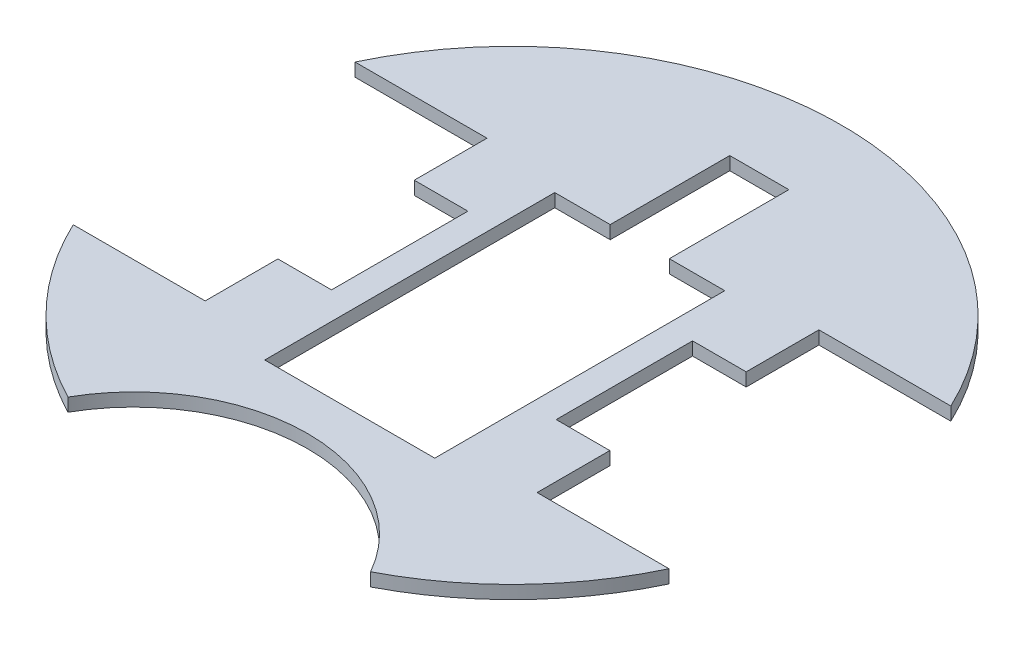
ISO-10303-21;
HEADER;
FILE_DESCRIPTION(('STEP AP214'),'2;1');
FILE_NAME('part.step','',(''),(''),'','','');
FILE_SCHEMA(('AUTOMOTIVE_DESIGN { 1 0 10303 214 1 1 1 1 }'));
ENDSEC;
DATA;
#1=APPLICATION_CONTEXT('core data for automotive mechanical design processes');
#2=APPLICATION_PROTOCOL_DEFINITION('international standard','automotive_design',2000,#1);
#3=PRODUCT_CONTEXT('',#1,'mechanical');
#4=PRODUCT('Part','Part','',(#3));
#5=PRODUCT_RELATED_PRODUCT_CATEGORY('part','',(#4));
#6=PRODUCT_DEFINITION_FORMATION('','',#4);
#7=PRODUCT_DEFINITION_CONTEXT('part definition',#1,'design');
#8=PRODUCT_DEFINITION('design','',#6,#7);
#9=PRODUCT_DEFINITION_SHAPE('','',#8);
#10=(LENGTH_UNIT() NAMED_UNIT(*) SI_UNIT(.MILLI.,.METRE.));
#11=(NAMED_UNIT(*) PLANE_ANGLE_UNIT() SI_UNIT($,.RADIAN.));
#12=(NAMED_UNIT(*) SI_UNIT($,.STERADIAN.) SOLID_ANGLE_UNIT());
#13=UNCERTAINTY_MEASURE_WITH_UNIT(LENGTH_MEASURE(1.E-05),#10,'distance_accuracy_value','');
#14=(GEOMETRIC_REPRESENTATION_CONTEXT(3) GLOBAL_UNCERTAINTY_ASSIGNED_CONTEXT((#13)) GLOBAL_UNIT_ASSIGNED_CONTEXT((#10,
#11,#12)) REPRESENTATION_CONTEXT('',''));
#15=CARTESIAN_POINT('',(0.,0.,0.));
#16=DIRECTION('',(0.,0.,1.));
#17=DIRECTION('',(1.,0.,0.));
#18=AXIS2_PLACEMENT_3D('',#15,#16,#17);
#19=CARTESIAN_POINT('',(18.7,0.,-28.1));
#20=DIRECTION('',(0.,0.,-1.));
#21=DIRECTION('',(-1.,0.,0.));
#22=AXIS2_PLACEMENT_3D('',#19,#20,#21);
#23=PLANE('',#22);
#24=DIRECTION('',(-1.,0.,0.));
#25=VECTOR('',#24,1.);
#26=CARTESIAN_POINT('',(18.7,0.,-28.1));
#27=LINE('',#26,#25);
#28=CARTESIAN_POINT('',(-6.5,0.,-28.1));
#29=VERTEX_POINT('',#28);
#30=CARTESIAN_POINT('',(-18.7,0.,-28.1));
#31=VERTEX_POINT('',#30);
#32=EDGE_CURVE('E222',#29,#31,#27,.T.);
#33=ORIENTED_EDGE('',*,*,#32,.F.);
#34=DIRECTION('',(0.,1.,0.));
#35=VECTOR('',#34,1.);
#36=CARTESIAN_POINT('',(-6.5,0.,-28.1));
#37=LINE('',#36,#35);
#38=CARTESIAN_POINT('',(-6.5,2.9,-28.1));
#39=VERTEX_POINT('',#38);
#40=EDGE_CURVE('E206',#29,#39,#37,.T.);
#41=ORIENTED_EDGE('',*,*,#40,.T.);
#42=DIRECTION('',(-1.,0.,0.));
#43=VECTOR('',#42,1.);
#44=CARTESIAN_POINT('',(18.7,2.9,-28.1));
#45=LINE('',#44,#43);
#46=CARTESIAN_POINT('',(-18.7,2.9,-28.1));
#47=VERTEX_POINT('',#46);
#48=EDGE_CURVE('E249',#39,#47,#45,.T.);
#49=ORIENTED_EDGE('',*,*,#48,.T.);
#50=DIRECTION('',(0.,1.,0.));
#51=VECTOR('',#50,1.);
#52=CARTESIAN_POINT('',(-18.7,0.,-28.1));
#53=LINE('',#52,#51);
#54=EDGE_CURVE('E228',#31,#47,#53,.T.);
#55=ORIENTED_EDGE('',*,*,#54,.F.);
#56=EDGE_LOOP('',(#33,#41,#49,#55));
#57=FACE_BOUND('',#56,.T.);
#58=ADVANCED_FACE('F33',(#57),#23,.F.);
#59=CARTESIAN_POINT('',(0.,2.9,0.));
#60=DIRECTION('',(0.,-1.,0.));
#61=DIRECTION('',(0.,0.,-1.));
#62=AXIS2_PLACEMENT_3D('',#59,#60,#61);
#63=CYLINDRICAL_SURFACE('',#62,72.5);
#64=CARTESIAN_POINT('',(0.,0.,0.));
#65=DIRECTION('',(0.,1.,0.));
#66=DIRECTION('',(0.,0.,1.));
#67=AXIS2_PLACEMENT_3D('',#64,#65,#66);
#68=CIRCLE('',#67,72.5);
#69=CARTESIAN_POINT('',(33.2911053697012,0.,64.4045984636458));
#70=VERTEX_POINT('',#69);
#71=CARTESIAN_POINT('',(65.5381568248605,0.,30.9999999999999));
#72=VERTEX_POINT('',#71);
#73=EDGE_CURVE('E266',#70,#72,#68,.T.);
#74=ORIENTED_EDGE('',*,*,#73,.T.);
#75=DIRECTION('',(0.,1.,0.));
#76=VECTOR('',#75,1.);
#77=CARTESIAN_POINT('',(65.5381568248605,0.,30.9999999999999));
#78=LINE('',#77,#76);
#79=CARTESIAN_POINT('',(65.5381568248605,2.9,30.9999999999999));
#80=VERTEX_POINT('',#79);
#81=EDGE_CURVE('E294',#72,#80,#78,.T.);
#82=ORIENTED_EDGE('',*,*,#81,.T.);
#83=CARTESIAN_POINT('',(0.,2.9,0.));
#84=DIRECTION('',(0.,1.,0.));
#85=DIRECTION('',(0.,0.,1.));
#86=AXIS2_PLACEMENT_3D('',#83,#84,#85);
#87=CIRCLE('',#86,72.5);
#88=CARTESIAN_POINT('',(33.2911053697012,2.9,64.4045984636458));
#89=VERTEX_POINT('',#88);
#90=EDGE_CURVE('E267',#89,#80,#87,.T.);
#91=ORIENTED_EDGE('',*,*,#90,.F.);
#92=DIRECTION('',(0.,-1.,0.));
#93=VECTOR('',#92,1.);
#94=CARTESIAN_POINT('',(33.2911053697012,2.9,64.4045984636458));
#95=LINE('',#94,#93);
#96=EDGE_CURVE('E11',#89,#70,#95,.T.);
#97=ORIENTED_EDGE('',*,*,#96,.T.);
#98=EDGE_LOOP('',(#74,#82,#91,#97));
#99=FACE_BOUND('',#98,.T.);
#100=ADVANCED_FACE('F293',(#99),#63,.T.);
#101=CARTESIAN_POINT('',(-65.5381568248605,2.9,30.9999999999999));
#102=VERTEX_POINT('',#101);
#103=CARTESIAN_POINT('',(-33.2911053697012,2.9,64.4045984636458));
#104=VERTEX_POINT('',#103);
#105=EDGE_CURVE('E265',#102,#104,#87,.T.);
#106=ORIENTED_EDGE('',*,*,#105,.F.);
#107=DIRECTION('',(0.,1.,0.));
#108=VECTOR('',#107,1.);
#109=CARTESIAN_POINT('',(-65.5381568248605,0.,30.9999999999999));
#110=LINE('',#109,#108);
#111=CARTESIAN_POINT('',(-65.5381568248605,0.,30.9999999999999));
#112=VERTEX_POINT('',#111);
#113=EDGE_CURVE('E327',#112,#102,#110,.T.);
#114=ORIENTED_EDGE('',*,*,#113,.F.);
#115=CARTESIAN_POINT('',(-33.2911053697012,0.,64.4045984636458));
#116=VERTEX_POINT('',#115);
#117=EDGE_CURVE('E273',#112,#116,#68,.T.);
#118=ORIENTED_EDGE('',*,*,#117,.T.);
#119=DIRECTION('',(0.,-1.,0.));
#120=VECTOR('',#119,1.);
#121=CARTESIAN_POINT('',(-33.2911053697012,2.9,64.4045984636458));
#122=LINE('',#121,#120);
#123=EDGE_CURVE('E41',#104,#116,#122,.T.);
#124=ORIENTED_EDGE('',*,*,#123,.F.);
#125=EDGE_LOOP('',(#106,#114,#118,#124));
#126=FACE_BOUND('',#125,.T.);
#127=ADVANCED_FACE('F461',(#126),#63,.T.);
#128=CARTESIAN_POINT('',(0.,2.9,83.2397996376034));
#129=DIRECTION('',(0.,-1.,0.));
#130=DIRECTION('',(0.,0.,-1.));
#131=AXIS2_PLACEMENT_3D('',#128,#129,#130);
#132=CYLINDRICAL_SURFACE('',#131,38.25);
#133=CARTESIAN_POINT('',(0.,0.,83.2397996376034));
#134=DIRECTION('',(0.,-1.,0.));
#135=DIRECTION('',(0.,0.,1.));
#136=AXIS2_PLACEMENT_3D('',#133,#134,#135);
#137=CIRCLE('',#136,38.25);
#138=EDGE_CURVE('E255',#116,#70,#137,.T.);
#139=ORIENTED_EDGE('',*,*,#138,.T.);
#140=ORIENTED_EDGE('',*,*,#96,.F.);
#141=CARTESIAN_POINT('',(0.,2.9,83.2397996376034));
#142=DIRECTION('',(0.,-1.,0.));
#143=DIRECTION('',(0.,0.,1.));
#144=AXIS2_PLACEMENT_3D('',#141,#142,#143);
#145=CIRCLE('',#144,38.25);
#146=EDGE_CURVE('E262',#104,#89,#145,.T.);
#147=ORIENTED_EDGE('',*,*,#146,.F.);
#148=ORIENTED_EDGE('',*,*,#123,.T.);
#149=EDGE_LOOP('',(#139,#140,#147,#148));
#150=FACE_BOUND('',#149,.T.);
#151=ADVANCED_FACE('F35',(#150),#132,.F.);
#152=CARTESIAN_POINT('',(65.5381568248604,2.9,-31.0000000000001));
#153=VERTEX_POINT('',#152);
#154=CARTESIAN_POINT('',(-65.5381568248604,2.9,-31.0000000000001));
#155=VERTEX_POINT('',#154);
#156=EDGE_CURVE('E270',#153,#155,#87,.T.);
#157=ORIENTED_EDGE('',*,*,#156,.F.);
#158=DIRECTION('',(0.,1.,0.));
#159=VECTOR('',#158,1.);
#160=CARTESIAN_POINT('',(65.5381568248604,0.,-31.0000000000001));
#161=LINE('',#160,#159);
#162=CARTESIAN_POINT('',(65.5381568248604,0.,-31.0000000000001));
#163=VERTEX_POINT('',#162);
#164=EDGE_CURVE('E383',#163,#153,#161,.T.);
#165=ORIENTED_EDGE('',*,*,#164,.F.);
#166=CARTESIAN_POINT('',(-65.5381568248604,0.,-31.0000000000001));
#167=VERTEX_POINT('',#166);
#168=EDGE_CURVE('E275',#163,#167,#68,.T.);
#169=ORIENTED_EDGE('',*,*,#168,.T.);
#170=DIRECTION('',(0.,1.,0.));
#171=VECTOR('',#170,1.);
#172=CARTESIAN_POINT('',(-65.5381568248604,0.,-31.0000000000001));
#173=LINE('',#172,#171);
#174=EDGE_CURVE('E319',#167,#155,#173,.T.);
#175=ORIENTED_EDGE('',*,*,#174,.T.);
#176=EDGE_LOOP('',(#157,#165,#169,#175));
#177=FACE_BOUND('',#176,.T.);
#178=ADVANCED_FACE('F325',(#177),#63,.T.);
#179=CARTESIAN_POINT('',(0.,2.9,41.6198998188017));
#180=DIRECTION('',(0.,1.,0.));
#181=DIRECTION('',(0.,0.,1.));
#182=AXIS2_PLACEMENT_3D('',#179,#180,#181);
#183=PLANE('',#182);
#184=DIRECTION('',(0.,0.,1.));
#185=VECTOR('',#184,1.);
#186=CARTESIAN_POINT('',(-6.5,2.9,-28.1));
#187=LINE('',#186,#185);
#188=CARTESIAN_POINT('',(-6.5,2.9,-54.4));
#189=VERTEX_POINT('',#188);
#190=EDGE_CURVE('E212',#189,#39,#187,.T.);
#191=ORIENTED_EDGE('',*,*,#190,.F.);
#192=DIRECTION('',(-1.,0.,0.));
#193=VECTOR('',#192,1.);
#194=CARTESIAN_POINT('',(6.5,2.9,-54.4));
#195=LINE('',#194,#193);
#196=CARTESIAN_POINT('',(6.5,2.9,-54.4));
#197=VERTEX_POINT('',#196);
#198=EDGE_CURVE('E225',#197,#189,#195,.T.);
#199=ORIENTED_EDGE('',*,*,#198,.F.);
#200=DIRECTION('',(0.,0.,-1.));
#201=VECTOR('',#200,1.);
#202=CARTESIAN_POINT('',(6.5,2.9,-28.1));
#203=LINE('',#202,#201);
#204=CARTESIAN_POINT('',(6.5,2.9,-28.1));
#205=VERTEX_POINT('',#204);
#206=EDGE_CURVE('E356',#205,#197,#203,.T.);
#207=ORIENTED_EDGE('',*,*,#206,.F.);
#208=CARTESIAN_POINT('',(18.7,2.9,-28.1));
#209=VERTEX_POINT('',#208);
#210=EDGE_CURVE('E250',#209,#205,#45,.T.);
#211=ORIENTED_EDGE('',*,*,#210,.F.);
#212=DIRECTION('',(0.,0.,-1.));
#213=VECTOR('',#212,1.);
#214=CARTESIAN_POINT('',(18.7,2.9,35.7));
#215=LINE('',#214,#213);
#216=CARTESIAN_POINT('',(18.7,2.9,35.7));
#217=VERTEX_POINT('',#216);
#218=EDGE_CURVE('E246',#217,#209,#215,.T.);
#219=ORIENTED_EDGE('',*,*,#218,.F.);
#220=DIRECTION('',(1.,0.,0.));
#221=VECTOR('',#220,1.);
#222=CARTESIAN_POINT('',(-18.7,2.9,35.7));
#223=LINE('',#222,#221);
#224=CARTESIAN_POINT('',(-18.7,2.9,35.7));
#225=VERTEX_POINT('',#224);
#226=EDGE_CURVE('E242',#225,#217,#223,.T.);
#227=ORIENTED_EDGE('',*,*,#226,.F.);
#228=DIRECTION('',(0.,0.,1.));
#229=VECTOR('',#228,1.);
#230=CARTESIAN_POINT('',(-18.7,2.9,-28.1));
#231=LINE('',#230,#229);
#232=EDGE_CURVE('E240',#47,#225,#231,.T.);
#233=ORIENTED_EDGE('',*,*,#232,.F.);
#234=ORIENTED_EDGE('',*,*,#48,.F.);
#235=EDGE_LOOP('',(#191,#199,#207,#211,#219,#227,#233,#234));
#236=FACE_BOUND('',#235,.T.);
#237=DIRECTION('',(1.,0.,0.));
#238=VECTOR('',#237,1.);
#239=CARTESIAN_POINT('',(36.5100000000001,2.9,30.9999999999999));
#240=LINE('',#239,#238);
#241=CARTESIAN_POINT('',(36.5100000000001,2.9,30.9999999999999));
#242=VERTEX_POINT('',#241);
#243=EDGE_CURVE('E369',#242,#80,#240,.T.);
#244=ORIENTED_EDGE('',*,*,#243,.F.);
#245=DIRECTION('',(0.,0.,1.));
#246=VECTOR('',#245,1.);
#247=CARTESIAN_POINT('',(36.5100000000001,2.9,15.));
#248=LINE('',#247,#246);
#249=CARTESIAN_POINT('',(36.5100000000001,2.9,15.));
#250=VERTEX_POINT('',#249);
#251=EDGE_CURVE('E397',#250,#242,#248,.T.);
#252=ORIENTED_EDGE('',*,*,#251,.F.);
#253=DIRECTION('',(1.,0.,0.));
#254=VECTOR('',#253,1.);
#255=CARTESIAN_POINT('',(24.7100000000001,2.9,15.));
#256=LINE('',#255,#254);
#257=CARTESIAN_POINT('',(24.7100000000001,2.9,15.));
#258=VERTEX_POINT('',#257);
#259=EDGE_CURVE('E394',#258,#250,#256,.T.);
#260=ORIENTED_EDGE('',*,*,#259,.F.);
#261=DIRECTION('',(0.,0.,1.));
#262=VECTOR('',#261,1.);
#263=CARTESIAN_POINT('',(24.7100000000001,2.9,-15.0000000000001));
#264=LINE('',#263,#262);
#265=CARTESIAN_POINT('',(24.7100000000001,2.9,-15.0000000000001));
#266=VERTEX_POINT('',#265);
#267=EDGE_CURVE('E391',#266,#258,#264,.T.);
#268=ORIENTED_EDGE('',*,*,#267,.F.);
#269=DIRECTION('',(-1.,0.,0.));
#270=VECTOR('',#269,1.);
#271=CARTESIAN_POINT('',(24.7100000000001,2.9,-15.0000000000001));
#272=LINE('',#271,#270);
#273=CARTESIAN_POINT('',(36.5100000000001,2.9,-15.0000000000001));
#274=VERTEX_POINT('',#273);
#275=EDGE_CURVE('E388',#274,#266,#272,.T.);
#276=ORIENTED_EDGE('',*,*,#275,.F.);
#277=DIRECTION('',(0.,0.,1.));
#278=VECTOR('',#277,1.);
#279=CARTESIAN_POINT('',(36.5100000000001,2.9,-15.0000000000001));
#280=LINE('',#279,#278);
#281=CARTESIAN_POINT('',(36.5100000000001,2.9,-31.0000000000001));
#282=VERTEX_POINT('',#281);
#283=EDGE_CURVE('E385',#282,#274,#280,.T.);
#284=ORIENTED_EDGE('',*,*,#283,.F.);
#285=DIRECTION('',(-1.,0.,0.));
#286=VECTOR('',#285,1.);
#287=CARTESIAN_POINT('',(36.5100000000001,2.9,-31.0000000000001));
#288=LINE('',#287,#286);
#289=EDGE_CURVE('E311',#153,#282,#288,.T.);
#290=ORIENTED_EDGE('',*,*,#289,.F.);
#291=ORIENTED_EDGE('',*,*,#156,.T.);
#292=DIRECTION('',(-1.,0.,0.));
#293=VECTOR('',#292,1.);
#294=CARTESIAN_POINT('',(-36.5100000000001,2.9,-31.0000000000001));
#295=LINE('',#294,#293);
#296=CARTESIAN_POINT('',(-36.5100000000001,2.9,-31.0000000000001));
#297=VERTEX_POINT('',#296);
#298=EDGE_CURVE('E308',#297,#155,#295,.T.);
#299=ORIENTED_EDGE('',*,*,#298,.F.);
#300=DIRECTION('',(0.,0.,-1.));
#301=VECTOR('',#300,1.);
#302=CARTESIAN_POINT('',(-36.5100000000001,2.9,-15.0000000000001));
#303=LINE('',#302,#301);
#304=CARTESIAN_POINT('',(-36.5100000000001,2.9,-15.0000000000001));
#305=VERTEX_POINT('',#304);
#306=EDGE_CURVE('E323',#305,#297,#303,.T.);
#307=ORIENTED_EDGE('',*,*,#306,.F.);
#308=DIRECTION('',(-1.,0.,0.));
#309=VECTOR('',#308,1.);
#310=CARTESIAN_POINT('',(-24.7100000000001,2.9,-15.0000000000001));
#311=LINE('',#310,#309);
#312=CARTESIAN_POINT('',(-24.7100000000001,2.9,-15.0000000000001));
#313=VERTEX_POINT('',#312);
#314=EDGE_CURVE('E437',#313,#305,#311,.T.);
#315=ORIENTED_EDGE('',*,*,#314,.F.);
#316=DIRECTION('',(0.,0.,-1.));
#317=VECTOR('',#316,1.);
#318=CARTESIAN_POINT('',(-24.7100000000001,2.9,-15.0000000000001));
#319=LINE('',#318,#317);
#320=CARTESIAN_POINT('',(-24.7100000000001,2.9,15.));
#321=VERTEX_POINT('',#320);
#322=EDGE_CURVE('E402',#321,#313,#319,.T.);
#323=ORIENTED_EDGE('',*,*,#322,.F.);
#324=DIRECTION('',(1.,0.,0.));
#325=VECTOR('',#324,1.);
#326=CARTESIAN_POINT('',(-24.7100000000001,2.9,15.));
#327=LINE('',#326,#325);
#328=CARTESIAN_POINT('',(-36.5100000000001,2.9,15.));
#329=VERTEX_POINT('',#328);
#330=EDGE_CURVE('E420',#329,#321,#327,.T.);
#331=ORIENTED_EDGE('',*,*,#330,.F.);
#332=DIRECTION('',(0.,0.,-1.));
#333=VECTOR('',#332,1.);
#334=CARTESIAN_POINT('',(-36.5100000000001,2.9,15.));
#335=LINE('',#334,#333);
#336=CARTESIAN_POINT('',(-36.5100000000001,2.9,30.9999999999999));
#337=VERTEX_POINT('',#336);
#338=EDGE_CURVE('E442',#337,#329,#335,.T.);
#339=ORIENTED_EDGE('',*,*,#338,.F.);
#340=DIRECTION('',(1.,0.,0.));
#341=VECTOR('',#340,1.);
#342=CARTESIAN_POINT('',(-36.5100000000001,2.9,30.9999999999999));
#343=LINE('',#342,#341);
#344=EDGE_CURVE('E301',#102,#337,#343,.T.);
#345=ORIENTED_EDGE('',*,*,#344,.F.);
#346=ORIENTED_EDGE('',*,*,#105,.T.);
#347=ORIENTED_EDGE('',*,*,#146,.T.);
#348=ORIENTED_EDGE('',*,*,#90,.T.);
#349=EDGE_LOOP('',(#244,#252,#260,#268,#276,#284,#290,#291,#299,#307,#315,#323,#331,#339,#345,
#346,#347,#348));
#350=FACE_BOUND('',#349,.T.);
#351=ADVANCED_FACE('F297',(#236,#350),#183,.T.);
#352=CARTESIAN_POINT('',(0.,0.,41.6198998188017));
#353=DIRECTION('',(0.,1.,0.));
#354=DIRECTION('',(0.,0.,1.));
#355=AXIS2_PLACEMENT_3D('',#352,#353,#354);
#356=PLANE('',#355);
#357=DIRECTION('',(0.,0.,1.));
#358=VECTOR('',#357,1.);
#359=CARTESIAN_POINT('',(36.5100000000001,0.,15.));
#360=LINE('',#359,#358);
#361=CARTESIAN_POINT('',(36.5100000000001,0.,15.));
#362=VERTEX_POINT('',#361);
#363=CARTESIAN_POINT('',(36.5100000000001,0.,30.9999999999999));
#364=VERTEX_POINT('',#363);
#365=EDGE_CURVE('E380',#362,#364,#360,.T.);
#366=ORIENTED_EDGE('',*,*,#365,.T.);
#367=DIRECTION('',(1.,0.,0.));
#368=VECTOR('',#367,1.);
#369=CARTESIAN_POINT('',(36.5100000000001,0.,30.9999999999999));
#370=LINE('',#369,#368);
#371=EDGE_CURVE('E290',#364,#72,#370,.T.);
#372=ORIENTED_EDGE('',*,*,#371,.T.);
#373=ORIENTED_EDGE('',*,*,#73,.F.);
#374=ORIENTED_EDGE('',*,*,#138,.F.);
#375=ORIENTED_EDGE('',*,*,#117,.F.);
#376=DIRECTION('',(1.,0.,0.));
#377=VECTOR('',#376,1.);
#378=CARTESIAN_POINT('',(-36.5100000000001,0.,30.9999999999999));
#379=LINE('',#378,#377);
#380=CARTESIAN_POINT('',(-36.5100000000001,0.,30.9999999999999));
#381=VERTEX_POINT('',#380);
#382=EDGE_CURVE('E428',#112,#381,#379,.T.);
#383=ORIENTED_EDGE('',*,*,#382,.T.);
#384=DIRECTION('',(0.,0.,-1.));
#385=VECTOR('',#384,1.);
#386=CARTESIAN_POINT('',(-36.5100000000001,0.,15.));
#387=LINE('',#386,#385);
#388=CARTESIAN_POINT('',(-36.5100000000001,0.,15.));
#389=VERTEX_POINT('',#388);
#390=EDGE_CURVE('E430',#381,#389,#387,.T.);
#391=ORIENTED_EDGE('',*,*,#390,.T.);
#392=DIRECTION('',(1.,0.,0.));
#393=VECTOR('',#392,1.);
#394=CARTESIAN_POINT('',(-24.7100000000001,0.,15.));
#395=LINE('',#394,#393);
#396=CARTESIAN_POINT('',(-24.7100000000001,0.,15.));
#397=VERTEX_POINT('',#396);
#398=EDGE_CURVE('E338',#389,#397,#395,.T.);
#399=ORIENTED_EDGE('',*,*,#398,.T.);
#400=DIRECTION('',(0.,0.,-1.));
#401=VECTOR('',#400,1.);
#402=CARTESIAN_POINT('',(-24.7100000000001,0.,-15.0000000000001));
#403=LINE('',#402,#401);
#404=CARTESIAN_POINT('',(-24.7100000000001,0.,-15.0000000000001));
#405=VERTEX_POINT('',#404);
#406=EDGE_CURVE('E416',#397,#405,#403,.T.);
#407=ORIENTED_EDGE('',*,*,#406,.T.);
#408=DIRECTION('',(-1.,0.,0.));
#409=VECTOR('',#408,1.);
#410=CARTESIAN_POINT('',(-24.7100000000001,0.,-15.0000000000001));
#411=LINE('',#410,#409);
#412=CARTESIAN_POINT('',(-36.5100000000001,0.,-15.0000000000001));
#413=VERTEX_POINT('',#412);
#414=EDGE_CURVE('E419',#405,#413,#411,.T.);
#415=ORIENTED_EDGE('',*,*,#414,.T.);
#416=DIRECTION('',(0.,0.,-1.));
#417=VECTOR('',#416,1.);
#418=CARTESIAN_POINT('',(-36.5100000000001,0.,-15.0000000000001));
#419=LINE('',#418,#417);
#420=CARTESIAN_POINT('',(-36.5100000000001,0.,-31.0000000000001));
#421=VERTEX_POINT('',#420);
#422=EDGE_CURVE('E423',#413,#421,#419,.T.);
#423=ORIENTED_EDGE('',*,*,#422,.T.);
#424=DIRECTION('',(-1.,0.,0.));
#425=VECTOR('',#424,1.);
#426=CARTESIAN_POINT('',(-36.5100000000001,0.,-31.0000000000001));
#427=LINE('',#426,#425);
#428=EDGE_CURVE('E426',#421,#167,#427,.T.);
#429=ORIENTED_EDGE('',*,*,#428,.T.);
#430=ORIENTED_EDGE('',*,*,#168,.F.);
#431=DIRECTION('',(-1.,0.,0.));
#432=VECTOR('',#431,1.);
#433=CARTESIAN_POINT('',(36.5100000000001,0.,-31.0000000000001));
#434=LINE('',#433,#432);
#435=CARTESIAN_POINT('',(36.5100000000001,0.,-31.0000000000001));
#436=VERTEX_POINT('',#435);
#437=EDGE_CURVE('E366',#163,#436,#434,.T.);
#438=ORIENTED_EDGE('',*,*,#437,.T.);
#439=DIRECTION('',(0.,0.,1.));
#440=VECTOR('',#439,1.);
#441=CARTESIAN_POINT('',(36.5100000000001,0.,-15.0000000000001));
#442=LINE('',#441,#440);
#443=CARTESIAN_POINT('',(36.5100000000001,0.,-15.0000000000001));
#444=VERTEX_POINT('',#443);
#445=EDGE_CURVE('E56',#436,#444,#442,.T.);
#446=ORIENTED_EDGE('',*,*,#445,.T.);
#447=DIRECTION('',(-1.,0.,0.));
#448=VECTOR('',#447,1.);
#449=CARTESIAN_POINT('',(24.7100000000001,0.,-15.0000000000001));
#450=LINE('',#449,#448);
#451=CARTESIAN_POINT('',(24.7100000000001,0.,-15.0000000000001));
#452=VERTEX_POINT('',#451);
#453=EDGE_CURVE('E371',#444,#452,#450,.T.);
#454=ORIENTED_EDGE('',*,*,#453,.T.);
#455=DIRECTION('',(0.,0.,1.));
#456=VECTOR('',#455,1.);
#457=CARTESIAN_POINT('',(24.7100000000001,0.,-15.0000000000001));
#458=LINE('',#457,#456);
#459=CARTESIAN_POINT('',(24.7100000000001,0.,15.));
#460=VERTEX_POINT('',#459);
#461=EDGE_CURVE('E374',#452,#460,#458,.T.);
#462=ORIENTED_EDGE('',*,*,#461,.T.);
#463=DIRECTION('',(1.,0.,0.));
#464=VECTOR('',#463,1.);
#465=CARTESIAN_POINT('',(24.7100000000001,0.,15.));
#466=LINE('',#465,#464);
#467=EDGE_CURVE('E377',#460,#362,#466,.T.);
#468=ORIENTED_EDGE('',*,*,#467,.T.);
#469=EDGE_LOOP('',(#366,#372,#373,#374,#375,#383,#391,#399,#407,#415,#423,#429,#430,#438,#446,
#454,#462,#468));
#470=FACE_BOUND('',#469,.T.);
#471=DIRECTION('',(-1.,0.,0.));
#472=VECTOR('',#471,1.);
#473=CARTESIAN_POINT('',(6.5,0.,-54.4));
#474=LINE('',#473,#472);
#475=CARTESIAN_POINT('',(6.5,0.,-54.4));
#476=VERTEX_POINT('',#475);
#477=CARTESIAN_POINT('',(-6.5,0.,-54.4));
#478=VERTEX_POINT('',#477);
#479=EDGE_CURVE('E217',#476,#478,#474,.T.);
#480=ORIENTED_EDGE('',*,*,#479,.T.);
#481=DIRECTION('',(0.,0.,1.));
#482=VECTOR('',#481,1.);
#483=CARTESIAN_POINT('',(-6.5,0.,-28.1));
#484=LINE('',#483,#482);
#485=EDGE_CURVE('E209',#478,#29,#484,.T.);
#486=ORIENTED_EDGE('',*,*,#485,.T.);
#487=ORIENTED_EDGE('',*,*,#32,.T.);
#488=DIRECTION('',(0.,0.,1.));
#489=VECTOR('',#488,1.);
#490=CARTESIAN_POINT('',(-18.7,0.,-28.1));
#491=LINE('',#490,#489);
#492=CARTESIAN_POINT('',(-18.7,0.,35.7));
#493=VERTEX_POINT('',#492);
#494=EDGE_CURVE('E253',#31,#493,#491,.T.);
#495=ORIENTED_EDGE('',*,*,#494,.T.);
#496=DIRECTION('',(1.,0.,0.));
#497=VECTOR('',#496,1.);
#498=CARTESIAN_POINT('',(-18.7,0.,35.7));
#499=LINE('',#498,#497);
#500=CARTESIAN_POINT('',(18.7,0.,35.7));
#501=VERTEX_POINT('',#500);
#502=EDGE_CURVE('E236',#493,#501,#499,.T.);
#503=ORIENTED_EDGE('',*,*,#502,.T.);
#504=DIRECTION('',(0.,0.,-1.));
#505=VECTOR('',#504,1.);
#506=CARTESIAN_POINT('',(18.7,0.,35.7));
#507=LINE('',#506,#505);
#508=CARTESIAN_POINT('',(18.7,0.,-28.1));
#509=VERTEX_POINT('',#508);
#510=EDGE_CURVE('E231',#501,#509,#507,.T.);
#511=ORIENTED_EDGE('',*,*,#510,.T.);
#512=CARTESIAN_POINT('',(6.5,0.,-28.1));
#513=VERTEX_POINT('',#512);
#514=EDGE_CURVE('E230',#509,#513,#27,.T.);
#515=ORIENTED_EDGE('',*,*,#514,.T.);
#516=DIRECTION('',(0.,0.,-1.));
#517=VECTOR('',#516,1.);
#518=CARTESIAN_POINT('',(6.5,0.,-28.1));
#519=LINE('',#518,#517);
#520=EDGE_CURVE('E48',#513,#476,#519,.T.);
#521=ORIENTED_EDGE('',*,*,#520,.T.);
#522=EDGE_LOOP('',(#480,#486,#487,#495,#503,#511,#515,#521));
#523=FACE_BOUND('',#522,.T.);
#524=ADVANCED_FACE('F220',(#470,#523),#356,.F.);
#525=CARTESIAN_POINT('',(-18.7,0.,-28.1));
#526=DIRECTION('',(-1.,0.,0.));
#527=DIRECTION('',(0.,0.,1.));
#528=AXIS2_PLACEMENT_3D('',#525,#526,#527);
#529=PLANE('',#528);
#530=ORIENTED_EDGE('',*,*,#232,.T.);
#531=DIRECTION('',(0.,1.,0.));
#532=VECTOR('',#531,1.);
#533=CARTESIAN_POINT('',(-18.7,0.,35.7));
#534=LINE('',#533,#532);
#535=EDGE_CURVE('E234',#493,#225,#534,.T.);
#536=ORIENTED_EDGE('',*,*,#535,.F.);
#537=ORIENTED_EDGE('',*,*,#494,.F.);
#538=ORIENTED_EDGE('',*,*,#54,.T.);
#539=EDGE_LOOP('',(#530,#536,#537,#538));
#540=FACE_BOUND('',#539,.T.);
#541=ADVANCED_FACE('F476',(#540),#529,.F.);
#542=ORIENTED_EDGE('',*,*,#210,.T.);
#543=DIRECTION('',(0.,1.,0.));
#544=VECTOR('',#543,1.);
#545=CARTESIAN_POINT('',(6.5,0.,-28.1));
#546=LINE('',#545,#544);
#547=EDGE_CURVE('E216',#513,#205,#546,.T.);
#548=ORIENTED_EDGE('',*,*,#547,.F.);
#549=ORIENTED_EDGE('',*,*,#514,.F.);
#550=DIRECTION('',(0.,1.,0.));
#551=VECTOR('',#550,1.);
#552=CARTESIAN_POINT('',(18.7,0.,-28.1));
#553=LINE('',#552,#551);
#554=EDGE_CURVE('E256',#509,#209,#553,.T.);
#555=ORIENTED_EDGE('',*,*,#554,.T.);
#556=EDGE_LOOP('',(#542,#548,#549,#555));
#557=FACE_BOUND('',#556,.T.);
#558=ADVANCED_FACE('F351',(#557),#23,.F.);
#559=CARTESIAN_POINT('',(18.7,0.,35.7));
#560=DIRECTION('',(1.,0.,0.));
#561=DIRECTION('',(0.,0.,-1.));
#562=AXIS2_PLACEMENT_3D('',#559,#560,#561);
#563=PLANE('',#562);
#564=ORIENTED_EDGE('',*,*,#218,.T.);
#565=ORIENTED_EDGE('',*,*,#554,.F.);
#566=ORIENTED_EDGE('',*,*,#510,.F.);
#567=DIRECTION('',(0.,1.,0.));
#568=VECTOR('',#567,1.);
#569=CARTESIAN_POINT('',(18.7,0.,35.7));
#570=LINE('',#569,#568);
#571=EDGE_CURVE('E258',#501,#217,#570,.T.);
#572=ORIENTED_EDGE('',*,*,#571,.T.);
#573=EDGE_LOOP('',(#564,#565,#566,#572));
#574=FACE_BOUND('',#573,.T.);
#575=ADVANCED_FACE('F347',(#574),#563,.F.);
#576=CARTESIAN_POINT('',(-18.7,0.,35.7));
#577=DIRECTION('',(0.,0.,1.));
#578=DIRECTION('',(1.,0.,0.));
#579=AXIS2_PLACEMENT_3D('',#576,#577,#578);
#580=PLANE('',#579);
#581=ORIENTED_EDGE('',*,*,#226,.T.);
#582=ORIENTED_EDGE('',*,*,#571,.F.);
#583=ORIENTED_EDGE('',*,*,#502,.F.);
#584=ORIENTED_EDGE('',*,*,#535,.T.);
#585=EDGE_LOOP('',(#581,#582,#583,#584));
#586=FACE_BOUND('',#585,.T.);
#587=ADVANCED_FACE('F343',(#586),#580,.F.);
#588=CARTESIAN_POINT('',(-24.7100000000001,0.,-15.0000000000001));
#589=DIRECTION('',(1.,0.,0.));
#590=DIRECTION('',(0.,0.,-1.));
#591=AXIS2_PLACEMENT_3D('',#588,#589,#590);
#592=PLANE('',#591);
#593=ORIENTED_EDGE('',*,*,#322,.T.);
#594=DIRECTION('',(0.,1.,0.));
#595=VECTOR('',#594,1.);
#596=CARTESIAN_POINT('',(-24.7100000000001,0.,-15.0000000000001));
#597=LINE('',#596,#595);
#598=EDGE_CURVE('E336',#405,#313,#597,.T.);
#599=ORIENTED_EDGE('',*,*,#598,.F.);
#600=ORIENTED_EDGE('',*,*,#406,.F.);
#601=DIRECTION('',(0.,1.,0.));
#602=VECTOR('',#601,1.);
#603=CARTESIAN_POINT('',(-24.7100000000001,0.,15.));
#604=LINE('',#603,#602);
#605=EDGE_CURVE('E243',#397,#321,#604,.T.);
#606=ORIENTED_EDGE('',*,*,#605,.T.);
#607=EDGE_LOOP('',(#593,#599,#600,#606));
#608=FACE_BOUND('',#607,.T.);
#609=ADVANCED_FACE('F537',(#608),#592,.F.);
#610=CARTESIAN_POINT('',(-24.7100000000001,0.,15.));
#611=DIRECTION('',(0.,0.,1.));
#612=DIRECTION('',(1.,0.,0.));
#613=AXIS2_PLACEMENT_3D('',#610,#611,#612);
#614=PLANE('',#613);
#615=ORIENTED_EDGE('',*,*,#330,.T.);
#616=ORIENTED_EDGE('',*,*,#605,.F.);
#617=ORIENTED_EDGE('',*,*,#398,.F.);
#618=DIRECTION('',(0.,1.,0.));
#619=VECTOR('',#618,1.);
#620=CARTESIAN_POINT('',(-36.5100000000001,0.,15.));
#621=LINE('',#620,#619);
#622=EDGE_CURVE('E448',#389,#329,#621,.T.);
#623=ORIENTED_EDGE('',*,*,#622,.T.);
#624=EDGE_LOOP('',(#615,#616,#617,#623));
#625=FACE_BOUND('',#624,.T.);
#626=ADVANCED_FACE('F458',(#625),#614,.F.);
#627=CARTESIAN_POINT('',(-36.5100000000001,0.,15.));
#628=DIRECTION('',(1.,0.,0.));
#629=DIRECTION('',(0.,0.,-1.));
#630=AXIS2_PLACEMENT_3D('',#627,#628,#629);
#631=PLANE('',#630);
#632=ORIENTED_EDGE('',*,*,#338,.T.);
#633=ORIENTED_EDGE('',*,*,#622,.F.);
#634=ORIENTED_EDGE('',*,*,#390,.F.);
#635=DIRECTION('',(0.,1.,0.));
#636=VECTOR('',#635,1.);
#637=CARTESIAN_POINT('',(-36.5100000000001,0.,30.9999999999999));
#638=LINE('',#637,#636);
#639=EDGE_CURVE('E329',#381,#337,#638,.T.);
#640=ORIENTED_EDGE('',*,*,#639,.T.);
#641=EDGE_LOOP('',(#632,#633,#634,#640));
#642=FACE_BOUND('',#641,.T.);
#643=ADVANCED_FACE('F451',(#642),#631,.F.);
#644=CARTESIAN_POINT('',(-36.5100000000001,0.,30.9999999999999));
#645=DIRECTION('',(0.,0.,1.));
#646=DIRECTION('',(1.,0.,0.));
#647=AXIS2_PLACEMENT_3D('',#644,#645,#646);
#648=PLANE('',#647);
#649=ORIENTED_EDGE('',*,*,#344,.T.);
#650=ORIENTED_EDGE('',*,*,#639,.F.);
#651=ORIENTED_EDGE('',*,*,#382,.F.);
#652=ORIENTED_EDGE('',*,*,#113,.T.);
#653=EDGE_LOOP('',(#649,#650,#651,#652));
#654=FACE_BOUND('',#653,.T.);
#655=ADVANCED_FACE('F454',(#654),#648,.F.);
#656=CARTESIAN_POINT('',(-36.5100000000001,0.,-31.0000000000001));
#657=DIRECTION('',(0.,0.,-1.));
#658=DIRECTION('',(-1.,0.,0.));
#659=AXIS2_PLACEMENT_3D('',#656,#657,#658);
#660=PLANE('',#659);
#661=ORIENTED_EDGE('',*,*,#298,.T.);
#662=ORIENTED_EDGE('',*,*,#174,.F.);
#663=ORIENTED_EDGE('',*,*,#428,.F.);
#664=DIRECTION('',(0.,1.,0.));
#665=VECTOR('',#664,1.);
#666=CARTESIAN_POINT('',(-36.5100000000001,0.,-31.0000000000001));
#667=LINE('',#666,#665);
#668=EDGE_CURVE('E321',#421,#297,#667,.T.);
#669=ORIENTED_EDGE('',*,*,#668,.T.);
#670=EDGE_LOOP('',(#661,#662,#663,#669));
#671=FACE_BOUND('',#670,.T.);
#672=ADVANCED_FACE('F317',(#671),#660,.F.);
#673=CARTESIAN_POINT('',(-36.5100000000001,0.,-15.0000000000001));
#674=DIRECTION('',(1.,0.,0.));
#675=DIRECTION('',(0.,0.,-1.));
#676=AXIS2_PLACEMENT_3D('',#673,#674,#675);
#677=PLANE('',#676);
#678=ORIENTED_EDGE('',*,*,#306,.T.);
#679=ORIENTED_EDGE('',*,*,#668,.F.);
#680=ORIENTED_EDGE('',*,*,#422,.F.);
#681=DIRECTION('',(0.,1.,0.));
#682=VECTOR('',#681,1.);
#683=CARTESIAN_POINT('',(-36.5100000000001,0.,-15.0000000000001));
#684=LINE('',#683,#682);
#685=EDGE_CURVE('E331',#413,#305,#684,.T.);
#686=ORIENTED_EDGE('',*,*,#685,.T.);
#687=EDGE_LOOP('',(#678,#679,#680,#686));
#688=FACE_BOUND('',#687,.T.);
#689=ADVANCED_FACE('F544',(#688),#677,.F.);
#690=CARTESIAN_POINT('',(-24.7100000000001,0.,-15.0000000000001));
#691=DIRECTION('',(0.,0.,-1.));
#692=DIRECTION('',(-1.,0.,0.));
#693=AXIS2_PLACEMENT_3D('',#690,#691,#692);
#694=PLANE('',#693);
#695=ORIENTED_EDGE('',*,*,#314,.T.);
#696=ORIENTED_EDGE('',*,*,#685,.F.);
#697=ORIENTED_EDGE('',*,*,#414,.F.);
#698=ORIENTED_EDGE('',*,*,#598,.T.);
#699=EDGE_LOOP('',(#695,#696,#697,#698));
#700=FACE_BOUND('',#699,.T.);
#701=ADVANCED_FACE('F512',(#700),#694,.F.);
#702=CARTESIAN_POINT('',(36.5100000000001,0.,30.9999999999999));
#703=DIRECTION('',(0.,0.,1.));
#704=DIRECTION('',(1.,0.,0.));
#705=AXIS2_PLACEMENT_3D('',#702,#703,#704);
#706=PLANE('',#705);
#707=ORIENTED_EDGE('',*,*,#243,.T.);
#708=ORIENTED_EDGE('',*,*,#81,.F.);
#709=ORIENTED_EDGE('',*,*,#371,.F.);
#710=DIRECTION('',(0.,1.,0.));
#711=VECTOR('',#710,1.);
#712=CARTESIAN_POINT('',(36.5100000000001,0.,30.9999999999999));
#713=LINE('',#712,#711);
#714=EDGE_CURVE('E403',#364,#242,#713,.T.);
#715=ORIENTED_EDGE('',*,*,#714,.T.);
#716=EDGE_LOOP('',(#707,#708,#709,#715));
#717=FACE_BOUND('',#716,.T.);
#718=ADVANCED_FACE('F508',(#717),#706,.F.);
#719=CARTESIAN_POINT('',(36.5100000000001,0.,15.));
#720=DIRECTION('',(-1.,0.,0.));
#721=DIRECTION('',(0.,0.,1.));
#722=AXIS2_PLACEMENT_3D('',#719,#720,#721);
#723=PLANE('',#722);
#724=ORIENTED_EDGE('',*,*,#251,.T.);
#725=ORIENTED_EDGE('',*,*,#714,.F.);
#726=ORIENTED_EDGE('',*,*,#365,.F.);
#727=DIRECTION('',(0.,1.,0.));
#728=VECTOR('',#727,1.);
#729=CARTESIAN_POINT('',(36.5100000000001,0.,15.));
#730=LINE('',#729,#728);
#731=EDGE_CURVE('E405',#362,#250,#730,.T.);
#732=ORIENTED_EDGE('',*,*,#731,.T.);
#733=EDGE_LOOP('',(#724,#725,#726,#732));
#734=FACE_BOUND('',#733,.T.);
#735=ADVANCED_FACE('F511',(#734),#723,.F.);
#736=CARTESIAN_POINT('',(24.7100000000001,0.,15.));
#737=DIRECTION('',(0.,0.,1.));
#738=DIRECTION('',(1.,0.,0.));
#739=AXIS2_PLACEMENT_3D('',#736,#737,#738);
#740=PLANE('',#739);
#741=ORIENTED_EDGE('',*,*,#259,.T.);
#742=ORIENTED_EDGE('',*,*,#731,.F.);
#743=ORIENTED_EDGE('',*,*,#467,.F.);
#744=DIRECTION('',(0.,1.,0.));
#745=VECTOR('',#744,1.);
#746=CARTESIAN_POINT('',(24.7100000000001,0.,15.));
#747=LINE('',#746,#745);
#748=EDGE_CURVE('E407',#460,#258,#747,.T.);
#749=ORIENTED_EDGE('',*,*,#748,.T.);
#750=EDGE_LOOP('',(#741,#742,#743,#749));
#751=FACE_BOUND('',#750,.T.);
#752=ADVANCED_FACE('F516',(#751),#740,.F.);
#753=CARTESIAN_POINT('',(24.7100000000001,0.,-15.0000000000001));
#754=DIRECTION('',(-1.,0.,0.));
#755=DIRECTION('',(0.,0.,1.));
#756=AXIS2_PLACEMENT_3D('',#753,#754,#755);
#757=PLANE('',#756);
#758=ORIENTED_EDGE('',*,*,#267,.T.);
#759=ORIENTED_EDGE('',*,*,#748,.F.);
#760=ORIENTED_EDGE('',*,*,#461,.F.);
#761=DIRECTION('',(0.,1.,0.));
#762=VECTOR('',#761,1.);
#763=CARTESIAN_POINT('',(24.7100000000001,0.,-15.0000000000001));
#764=LINE('',#763,#762);
#765=EDGE_CURVE('E409',#452,#266,#764,.T.);
#766=ORIENTED_EDGE('',*,*,#765,.T.);
#767=EDGE_LOOP('',(#758,#759,#760,#766));
#768=FACE_BOUND('',#767,.T.);
#769=ADVANCED_FACE('F520',(#768),#757,.F.);
#770=CARTESIAN_POINT('',(24.7100000000001,0.,-15.0000000000001));
#771=DIRECTION('',(0.,0.,-1.));
#772=DIRECTION('',(-1.,0.,0.));
#773=AXIS2_PLACEMENT_3D('',#770,#771,#772);
#774=PLANE('',#773);
#775=ORIENTED_EDGE('',*,*,#275,.T.);
#776=ORIENTED_EDGE('',*,*,#765,.F.);
#777=ORIENTED_EDGE('',*,*,#453,.F.);
#778=DIRECTION('',(0.,1.,0.));
#779=VECTOR('',#778,1.);
#780=CARTESIAN_POINT('',(36.5100000000001,0.,-15.0000000000001));
#781=LINE('',#780,#779);
#782=EDGE_CURVE('E411',#444,#274,#781,.T.);
#783=ORIENTED_EDGE('',*,*,#782,.T.);
#784=EDGE_LOOP('',(#775,#776,#777,#783));
#785=FACE_BOUND('',#784,.T.);
#786=ADVANCED_FACE('F524',(#785),#774,.F.);
#787=CARTESIAN_POINT('',(36.5100000000001,0.,-15.0000000000001));
#788=DIRECTION('',(-1.,0.,0.));
#789=DIRECTION('',(0.,0.,1.));
#790=AXIS2_PLACEMENT_3D('',#787,#788,#789);
#791=PLANE('',#790);
#792=ORIENTED_EDGE('',*,*,#283,.T.);
#793=ORIENTED_EDGE('',*,*,#782,.F.);
#794=ORIENTED_EDGE('',*,*,#445,.F.);
#795=DIRECTION('',(0.,1.,0.));
#796=VECTOR('',#795,1.);
#797=CARTESIAN_POINT('',(36.5100000000001,0.,-31.0000000000001));
#798=LINE('',#797,#796);
#799=EDGE_CURVE('E413',#436,#282,#798,.T.);
#800=ORIENTED_EDGE('',*,*,#799,.T.);
#801=EDGE_LOOP('',(#792,#793,#794,#800));
#802=FACE_BOUND('',#801,.T.);
#803=ADVANCED_FACE('F528',(#802),#791,.F.);
#804=CARTESIAN_POINT('',(36.5100000000001,0.,-31.0000000000001));
#805=DIRECTION('',(0.,0.,-1.));
#806=DIRECTION('',(-1.,0.,0.));
#807=AXIS2_PLACEMENT_3D('',#804,#805,#806);
#808=PLANE('',#807);
#809=ORIENTED_EDGE('',*,*,#289,.T.);
#810=ORIENTED_EDGE('',*,*,#799,.F.);
#811=ORIENTED_EDGE('',*,*,#437,.F.);
#812=ORIENTED_EDGE('',*,*,#164,.T.);
#813=EDGE_LOOP('',(#809,#810,#811,#812));
#814=FACE_BOUND('',#813,.T.);
#815=ADVANCED_FACE('F505',(#814),#808,.F.);
#816=CARTESIAN_POINT('',(-6.5,0.,-28.1));
#817=DIRECTION('',(-1.,0.,0.));
#818=DIRECTION('',(0.,0.,1.));
#819=AXIS2_PLACEMENT_3D('',#816,#817,#818);
#820=PLANE('',#819);
#821=ORIENTED_EDGE('',*,*,#190,.T.);
#822=ORIENTED_EDGE('',*,*,#40,.F.);
#823=ORIENTED_EDGE('',*,*,#485,.F.);
#824=DIRECTION('',(0.,1.,0.));
#825=VECTOR('',#824,1.);
#826=CARTESIAN_POINT('',(-6.5,0.,-54.4));
#827=LINE('',#826,#825);
#828=EDGE_CURVE('E361',#478,#189,#827,.T.);
#829=ORIENTED_EDGE('',*,*,#828,.T.);
#830=EDGE_LOOP('',(#821,#822,#823,#829));
#831=FACE_BOUND('',#830,.T.);
#832=ADVANCED_FACE('F208',(#831),#820,.F.);
#833=CARTESIAN_POINT('',(6.5,0.,-54.4));
#834=DIRECTION('',(0.,0.,-1.));
#835=DIRECTION('',(-1.,0.,0.));
#836=AXIS2_PLACEMENT_3D('',#833,#834,#835);
#837=PLANE('',#836);
#838=ORIENTED_EDGE('',*,*,#198,.T.);
#839=ORIENTED_EDGE('',*,*,#828,.F.);
#840=ORIENTED_EDGE('',*,*,#479,.F.);
#841=DIRECTION('',(0.,1.,0.));
#842=VECTOR('',#841,1.);
#843=CARTESIAN_POINT('',(6.5,0.,-54.4));
#844=LINE('',#843,#842);
#845=EDGE_CURVE('E363',#476,#197,#844,.T.);
#846=ORIENTED_EDGE('',*,*,#845,.T.);
#847=EDGE_LOOP('',(#838,#839,#840,#846));
#848=FACE_BOUND('',#847,.T.);
#849=ADVANCED_FACE('F497',(#848),#837,.F.);
#850=CARTESIAN_POINT('',(6.5,0.,-28.1));
#851=DIRECTION('',(1.,0.,0.));
#852=DIRECTION('',(0.,0.,-1.));
#853=AXIS2_PLACEMENT_3D('',#850,#851,#852);
#854=PLANE('',#853);
#855=ORIENTED_EDGE('',*,*,#206,.T.);
#856=ORIENTED_EDGE('',*,*,#845,.F.);
#857=ORIENTED_EDGE('',*,*,#520,.F.);
#858=ORIENTED_EDGE('',*,*,#547,.T.);
#859=EDGE_LOOP('',(#855,#856,#857,#858));
#860=FACE_BOUND('',#859,.T.);
#861=ADVANCED_FACE('F495',(#860),#854,.F.);
#862=CLOSED_SHELL('',(#58,#100,#127,#151,#178,#351,#524,#541,#558,#575,#587,#609,#626,#643,#655,
#672,#689,#701,#718,#735,#752,#769,#786,#803,#815,#832,#849,#861));
#863=MANIFOLD_SOLID_BREP('B2',#862);
#864=ADVANCED_BREP_SHAPE_REPRESENTATION('',(#18,#863),#14);
#865=SHAPE_DEFINITION_REPRESENTATION(#9,#864);
ENDSEC;
END-ISO-10303-21;
